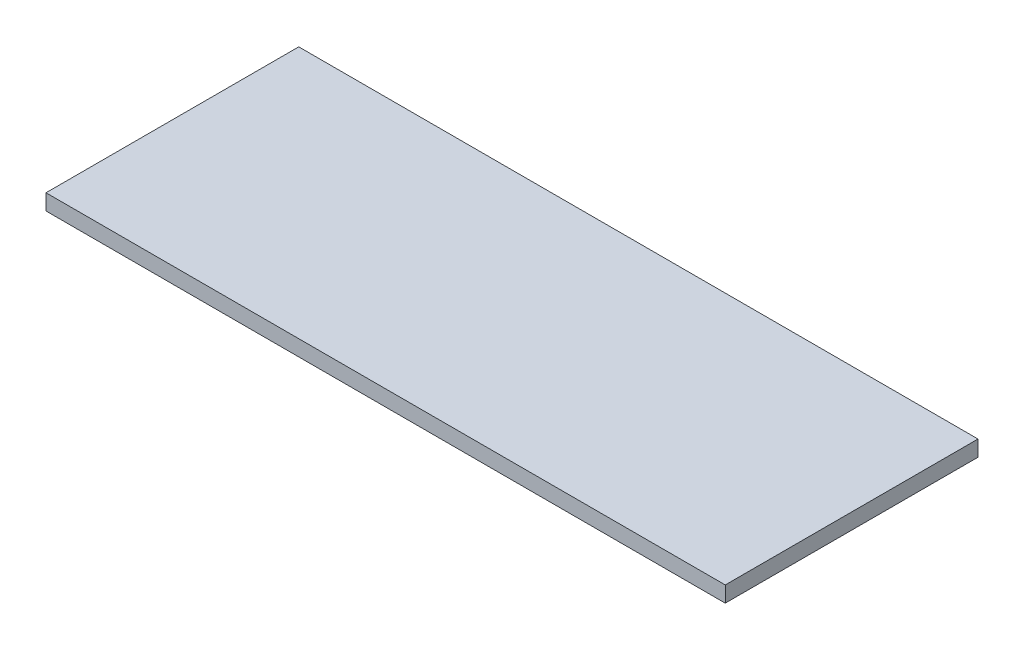
ISO-10303-21;
HEADER;
FILE_DESCRIPTION(('STEP AP214'),'2;1');
FILE_NAME('part.step','',(''),(''),'','','');
FILE_SCHEMA(('AUTOMOTIVE_DESIGN { 1 0 10303 214 1 1 1 1 }'));
ENDSEC;
DATA;
#1=APPLICATION_CONTEXT('core data for automotive mechanical design processes');
#2=APPLICATION_PROTOCOL_DEFINITION('international standard','automotive_design',2000,#1);
#3=PRODUCT_CONTEXT('',#1,'mechanical');
#4=PRODUCT('Part','Part','',(#3));
#5=PRODUCT_RELATED_PRODUCT_CATEGORY('part','',(#4));
#6=PRODUCT_DEFINITION_FORMATION('','',#4);
#7=PRODUCT_DEFINITION_CONTEXT('part definition',#1,'design');
#8=PRODUCT_DEFINITION('design','',#6,#7);
#9=PRODUCT_DEFINITION_SHAPE('','',#8);
#10=(LENGTH_UNIT() NAMED_UNIT(*) SI_UNIT(.MILLI.,.METRE.));
#11=(NAMED_UNIT(*) PLANE_ANGLE_UNIT() SI_UNIT($,.RADIAN.));
#12=(NAMED_UNIT(*) SI_UNIT($,.STERADIAN.) SOLID_ANGLE_UNIT());
#13=UNCERTAINTY_MEASURE_WITH_UNIT(LENGTH_MEASURE(1.E-05),#10,'distance_accuracy_value','');
#14=(GEOMETRIC_REPRESENTATION_CONTEXT(3) GLOBAL_UNCERTAINTY_ASSIGNED_CONTEXT((#13)) GLOBAL_UNIT_ASSIGNED_CONTEXT((#10,
#11,#12)) REPRESENTATION_CONTEXT('',''));
#15=CARTESIAN_POINT('',(0.,0.,0.));
#16=DIRECTION('',(0.,0.,1.));
#17=DIRECTION('',(1.,0.,0.));
#18=AXIS2_PLACEMENT_3D('',#15,#16,#17);
#19=CARTESIAN_POINT('',(64.5,3.,-24.));
#20=DIRECTION('',(-1.,0.,0.));
#21=DIRECTION('',(0.,0.,1.));
#22=AXIS2_PLACEMENT_3D('',#19,#20,#21);
#23=PLANE('',#22);
#24=DIRECTION('',(0.,0.,-1.));
#25=VECTOR('',#24,1.);
#26=CARTESIAN_POINT('',(64.5,0.,-24.));
#27=LINE('',#26,#25);
#28=CARTESIAN_POINT('',(64.5,0.,24.));
#29=VERTEX_POINT('',#28);
#30=CARTESIAN_POINT('',(64.5,0.,-24.));
#31=VERTEX_POINT('',#30);
#32=EDGE_CURVE('E100',#29,#31,#27,.T.);
#33=ORIENTED_EDGE('',*,*,#32,.T.);
#34=DIRECTION('',(0.,-1.,0.));
#35=VECTOR('',#34,1.);
#36=CARTESIAN_POINT('',(64.5,3.,-24.));
#37=LINE('',#36,#35);
#38=CARTESIAN_POINT('',(64.5,3.,-24.));
#39=VERTEX_POINT('',#38);
#40=EDGE_CURVE('E11',#39,#31,#37,.T.);
#41=ORIENTED_EDGE('',*,*,#40,.F.);
#42=DIRECTION('',(0.,0.,-1.));
#43=VECTOR('',#42,1.);
#44=CARTESIAN_POINT('',(64.5,3.,-24.));
#45=LINE('',#44,#43);
#46=CARTESIAN_POINT('',(64.5,3.,24.));
#47=VERTEX_POINT('',#46);
#48=EDGE_CURVE('E88',#47,#39,#45,.T.);
#49=ORIENTED_EDGE('',*,*,#48,.F.);
#50=DIRECTION('',(0.,-1.,0.));
#51=VECTOR('',#50,1.);
#52=CARTESIAN_POINT('',(64.5,3.,24.));
#53=LINE('',#52,#51);
#54=EDGE_CURVE('E96',#47,#29,#53,.T.);
#55=ORIENTED_EDGE('',*,*,#54,.T.);
#56=EDGE_LOOP('',(#33,#41,#49,#55));
#57=FACE_BOUND('',#56,.T.);
#58=ADVANCED_FACE('F37',(#57),#23,.F.);
#59=CARTESIAN_POINT('',(-64.5,3.,-24.));
#60=DIRECTION('',(0.,0.,1.));
#61=DIRECTION('',(1.,0.,0.));
#62=AXIS2_PLACEMENT_3D('',#59,#60,#61);
#63=PLANE('',#62);
#64=DIRECTION('',(-1.,0.,0.));
#65=VECTOR('',#64,1.);
#66=CARTESIAN_POINT('',(-64.5,0.,-24.));
#67=LINE('',#66,#65);
#68=CARTESIAN_POINT('',(-64.5,0.,-24.));
#69=VERTEX_POINT('',#68);
#70=EDGE_CURVE('E92',#31,#69,#67,.T.);
#71=ORIENTED_EDGE('',*,*,#70,.T.);
#72=DIRECTION('',(0.,-1.,0.));
#73=VECTOR('',#72,1.);
#74=CARTESIAN_POINT('',(-64.5,3.,-24.));
#75=LINE('',#74,#73);
#76=CARTESIAN_POINT('',(-64.5,3.,-24.));
#77=VERTEX_POINT('',#76);
#78=EDGE_CURVE('E45',#77,#69,#75,.T.);
#79=ORIENTED_EDGE('',*,*,#78,.F.);
#80=DIRECTION('',(-1.,0.,0.));
#81=VECTOR('',#80,1.);
#82=CARTESIAN_POINT('',(-64.5,3.,-24.));
#83=LINE('',#82,#81);
#84=EDGE_CURVE('E83',#39,#77,#83,.T.);
#85=ORIENTED_EDGE('',*,*,#84,.F.);
#86=ORIENTED_EDGE('',*,*,#40,.T.);
#87=EDGE_LOOP('',(#71,#79,#85,#86));
#88=FACE_BOUND('',#87,.T.);
#89=ADVANCED_FACE('F91',(#88),#63,.F.);
#90=CARTESIAN_POINT('',(-64.5,3.,-24.));
#91=DIRECTION('',(1.,0.,0.));
#92=DIRECTION('',(0.,0.,-1.));
#93=AXIS2_PLACEMENT_3D('',#90,#91,#92);
#94=PLANE('',#93);
#95=DIRECTION('',(0.,0.,1.));
#96=VECTOR('',#95,1.);
#97=CARTESIAN_POINT('',(-64.5,0.,-24.));
#98=LINE('',#97,#96);
#99=CARTESIAN_POINT('',(-64.5,0.,24.));
#100=VERTEX_POINT('',#99);
#101=EDGE_CURVE('E70',#69,#100,#98,.T.);
#102=ORIENTED_EDGE('',*,*,#101,.T.);
#103=DIRECTION('',(0.,-1.,0.));
#104=VECTOR('',#103,1.);
#105=CARTESIAN_POINT('',(-64.5,3.,24.));
#106=LINE('',#105,#104);
#107=CARTESIAN_POINT('',(-64.5,3.,24.));
#108=VERTEX_POINT('',#107);
#109=EDGE_CURVE('E93',#108,#100,#106,.T.);
#110=ORIENTED_EDGE('',*,*,#109,.F.);
#111=DIRECTION('',(0.,0.,1.));
#112=VECTOR('',#111,1.);
#113=CARTESIAN_POINT('',(-64.5,3.,-24.));
#114=LINE('',#113,#112);
#115=EDGE_CURVE('E86',#77,#108,#114,.T.);
#116=ORIENTED_EDGE('',*,*,#115,.F.);
#117=ORIENTED_EDGE('',*,*,#78,.T.);
#118=EDGE_LOOP('',(#102,#110,#116,#117));
#119=FACE_BOUND('',#118,.T.);
#120=ADVANCED_FACE('F94',(#119),#94,.F.);
#121=CARTESIAN_POINT('',(-64.5,3.,24.));
#122=DIRECTION('',(0.,0.,-1.));
#123=DIRECTION('',(-1.,0.,0.));
#124=AXIS2_PLACEMENT_3D('',#121,#122,#123);
#125=PLANE('',#124);
#126=DIRECTION('',(1.,0.,0.));
#127=VECTOR('',#126,1.);
#128=CARTESIAN_POINT('',(-64.5,0.,24.));
#129=LINE('',#128,#127);
#130=EDGE_CURVE('E76',#100,#29,#129,.T.);
#131=ORIENTED_EDGE('',*,*,#130,.T.);
#132=ORIENTED_EDGE('',*,*,#54,.F.);
#133=DIRECTION('',(1.,0.,0.));
#134=VECTOR('',#133,1.);
#135=CARTESIAN_POINT('',(-64.5,3.,24.));
#136=LINE('',#135,#134);
#137=EDGE_CURVE('E53',#108,#47,#136,.T.);
#138=ORIENTED_EDGE('',*,*,#137,.F.);
#139=ORIENTED_EDGE('',*,*,#109,.T.);
#140=EDGE_LOOP('',(#131,#132,#138,#139));
#141=FACE_BOUND('',#140,.T.);
#142=ADVANCED_FACE('F107',(#141),#125,.F.);
#143=CARTESIAN_POINT('',(0.,3.,0.));
#144=DIRECTION('',(0.,1.,0.));
#145=DIRECTION('',(0.,0.,1.));
#146=AXIS2_PLACEMENT_3D('',#143,#144,#145);
#147=PLANE('',#146);
#148=ORIENTED_EDGE('',*,*,#48,.T.);
#149=ORIENTED_EDGE('',*,*,#84,.T.);
#150=ORIENTED_EDGE('',*,*,#115,.T.);
#151=ORIENTED_EDGE('',*,*,#137,.T.);
#152=EDGE_LOOP('',(#148,#149,#150,#151));
#153=FACE_BOUND('',#152,.T.);
#154=ADVANCED_FACE('F84',(#153),#147,.T.);
#155=CARTESIAN_POINT('',(0.,0.,0.));
#156=DIRECTION('',(0.,1.,0.));
#157=DIRECTION('',(0.,0.,1.));
#158=AXIS2_PLACEMENT_3D('',#155,#156,#157);
#159=PLANE('',#158);
#160=ORIENTED_EDGE('',*,*,#32,.F.);
#161=ORIENTED_EDGE('',*,*,#130,.F.);
#162=ORIENTED_EDGE('',*,*,#101,.F.);
#163=ORIENTED_EDGE('',*,*,#70,.F.);
#164=EDGE_LOOP('',(#160,#161,#162,#163));
#165=FACE_BOUND('',#164,.T.);
#166=ADVANCED_FACE('F110',(#165),#159,.F.);
#167=CLOSED_SHELL('',(#58,#89,#120,#142,#154,#166));
#168=MANIFOLD_SOLID_BREP('B2',#167);
#169=ADVANCED_BREP_SHAPE_REPRESENTATION('',(#18,#168),#14);
#170=SHAPE_DEFINITION_REPRESENTATION(#9,#169);
ENDSEC;
END-ISO-10303-21;
